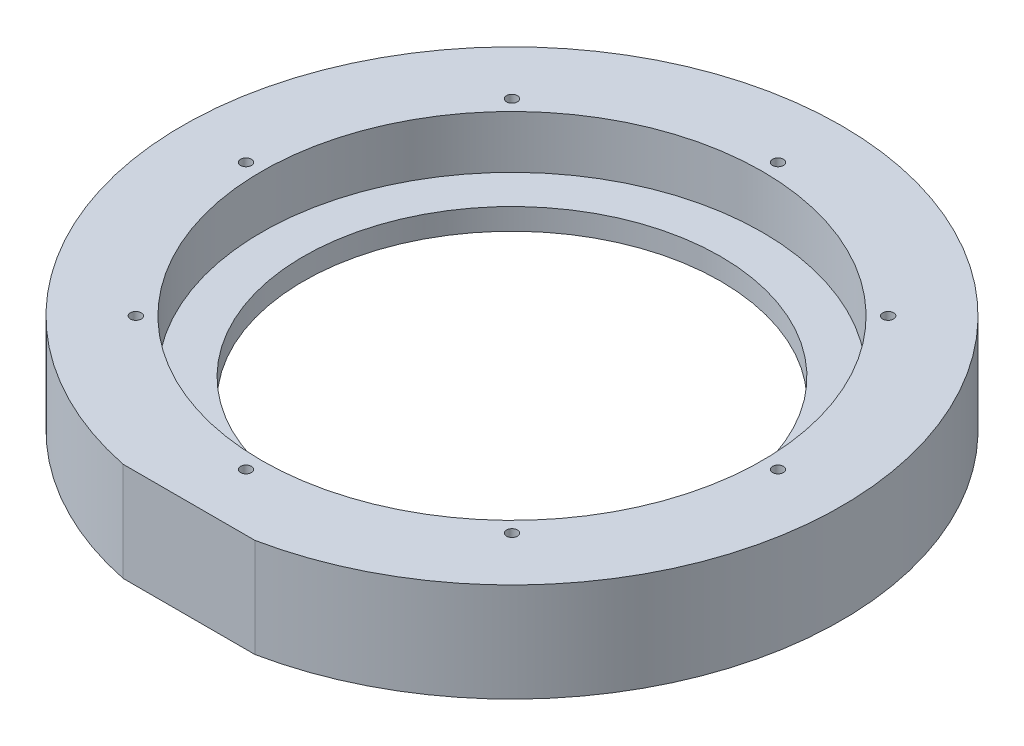
ISO-10303-21;
HEADER;
FILE_DESCRIPTION(('STEP AP214'),'2;1');
FILE_NAME('part.step','',(''),(''),'','','');
FILE_SCHEMA(('AUTOMOTIVE_DESIGN { 1 0 10303 214 1 1 1 1 }'));
ENDSEC;
DATA;
#1=APPLICATION_CONTEXT('core data for automotive mechanical design processes');
#2=APPLICATION_PROTOCOL_DEFINITION('international standard','automotive_design',2000,#1);
#3=PRODUCT_CONTEXT('',#1,'mechanical');
#4=PRODUCT('Part','Part','',(#3));
#5=PRODUCT_RELATED_PRODUCT_CATEGORY('part','',(#4));
#6=PRODUCT_DEFINITION_FORMATION('','',#4);
#7=PRODUCT_DEFINITION_CONTEXT('part definition',#1,'design');
#8=PRODUCT_DEFINITION('design','',#6,#7);
#9=PRODUCT_DEFINITION_SHAPE('','',#8);
#10=(LENGTH_UNIT() NAMED_UNIT(*) SI_UNIT(.MILLI.,.METRE.));
#11=(NAMED_UNIT(*) PLANE_ANGLE_UNIT() SI_UNIT($,.RADIAN.));
#12=(NAMED_UNIT(*) SI_UNIT($,.STERADIAN.) SOLID_ANGLE_UNIT());
#13=UNCERTAINTY_MEASURE_WITH_UNIT(LENGTH_MEASURE(1.E-05),#10,'distance_accuracy_value','');
#14=(GEOMETRIC_REPRESENTATION_CONTEXT(3) GLOBAL_UNCERTAINTY_ASSIGNED_CONTEXT((#13)) GLOBAL_UNIT_ASSIGNED_CONTEXT((#10,
#11,#12)) REPRESENTATION_CONTEXT('',''));
#15=CARTESIAN_POINT('',(0.,0.,0.));
#16=DIRECTION('',(0.,0.,1.));
#17=DIRECTION('',(1.,0.,0.));
#18=AXIS2_PLACEMENT_3D('',#15,#16,#17);
#19=CARTESIAN_POINT('',(0.,0.,0.));
#20=DIRECTION('',(0.,-1.,0.));
#21=DIRECTION('',(0.,0.,-1.));
#22=AXIS2_PLACEMENT_3D('',#19,#20,#21);
#23=CYLINDRICAL_SURFACE('',#22,80.3783);
#24=CARTESIAN_POINT('',(0.,0.,0.));
#25=DIRECTION('',(0.,-1.,0.));
#26=DIRECTION('',(0.,0.,-1.));
#27=AXIS2_PLACEMENT_3D('',#24,#25,#26);
#28=CIRCLE('',#27,80.3783);
#29=CARTESIAN_POINT('',(0.,0.,-80.3783));
#30=VERTEX_POINT('',#29);
#31=EDGE_CURVE('E11',#30,#30,#28,.T.);
#32=ORIENTED_EDGE('',*,*,#31,.T.);
#33=EDGE_LOOP('',(#32));
#34=FACE_BOUND('',#33,.T.);
#35=CARTESIAN_POINT('',(0.,8.255,0.));
#36=DIRECTION('',(0.,-1.,0.));
#37=DIRECTION('',(0.,0.,-1.));
#38=AXIS2_PLACEMENT_3D('',#35,#36,#37);
#39=CIRCLE('',#38,80.3783);
#40=CARTESIAN_POINT('',(0.,8.255,-80.3783));
#41=VERTEX_POINT('',#40);
#42=EDGE_CURVE('E151',#41,#41,#39,.T.);
#43=ORIENTED_EDGE('',*,*,#42,.F.);
#44=EDGE_LOOP('',(#43));
#45=FACE_BOUND('',#44,.T.);
#46=ADVANCED_FACE('F42',(#34,#45),#23,.F.);
#47=CARTESIAN_POINT('',(80.3783,0.,0.));
#48=DIRECTION('',(0.,-1.,0.));
#49=DIRECTION('',(0.,0.,-1.));
#50=AXIS2_PLACEMENT_3D('',#47,#48,#49);
#51=PLANE('',#50);
#52=CARTESIAN_POINT('',(6.35,0.,85.09));
#53=DIRECTION('',(0.,-1.,0.));
#54=DIRECTION('',(0.,0.,-1.));
#55=AXIS2_PLACEMENT_3D('',#52,#53,#54);
#56=CIRCLE('',#55,1.72719999999999);
#57=CARTESIAN_POINT('',(6.35,0.,83.3628));
#58=VERTEX_POINT('',#57);
#59=EDGE_CURVE('E214',#58,#58,#56,.T.);
#60=ORIENTED_EDGE('',*,*,#59,.F.);
#61=EDGE_LOOP('',(#60));
#62=FACE_BOUND('',#61,.T.);
#63=CARTESIAN_POINT('',(-6.35,0.,85.09));
#64=DIRECTION('',(0.,-1.,0.));
#65=DIRECTION('',(0.,0.,-1.));
#66=AXIS2_PLACEMENT_3D('',#63,#64,#65);
#67=CIRCLE('',#66,1.72719999999999);
#68=CARTESIAN_POINT('',(-6.35,0.,83.3628));
#69=VERTEX_POINT('',#68);
#70=EDGE_CURVE('E208',#69,#69,#67,.T.);
#71=ORIENTED_EDGE('',*,*,#70,.F.);
#72=EDGE_LOOP('',(#71));
#73=FACE_BOUND('',#72,.T.);
#74=CARTESIAN_POINT('',(0.,0.,0.));
#75=DIRECTION('',(0.,-1.,0.));
#76=DIRECTION('',(0.,0.,-1.));
#77=AXIS2_PLACEMENT_3D('',#74,#75,#76);
#78=CIRCLE('',#77,99.4283);
#79=CARTESIAN_POINT('',(0.,0.,-99.4283));
#80=VERTEX_POINT('',#79);
#81=EDGE_CURVE('E49',#80,#80,#78,.T.);
#82=ORIENTED_EDGE('',*,*,#81,.T.);
#83=EDGE_LOOP('',(#82));
#84=FACE_BOUND('',#83,.T.);
#85=ORIENTED_EDGE('',*,*,#31,.F.);
#86=EDGE_LOOP('',(#85));
#87=FACE_BOUND('',#86,.T.);
#88=ADVANCED_FACE('F127',(#62,#73,#84,#87),#51,.T.);
#89=CARTESIAN_POINT('',(0.,0.,0.));
#90=DIRECTION('',(0.,-1.,0.));
#91=DIRECTION('',(0.,0.,-1.));
#92=AXIS2_PLACEMENT_3D('',#89,#90,#91);
#93=CYLINDRICAL_SURFACE('',#92,99.4283);
#94=CARTESIAN_POINT('',(0.,-6.985,0.));
#95=DIRECTION('',(0.,-1.,0.));
#96=DIRECTION('',(0.,0.,-1.));
#97=AXIS2_PLACEMENT_3D('',#94,#95,#96);
#98=CIRCLE('',#97,99.4283);
#99=CARTESIAN_POINT('',(0.,-6.985,-99.4283));
#100=VERTEX_POINT('',#99);
#101=EDGE_CURVE('E122',#100,#100,#98,.T.);
#102=ORIENTED_EDGE('',*,*,#101,.T.);
#103=EDGE_LOOP('',(#102));
#104=FACE_BOUND('',#103,.T.);
#105=ORIENTED_EDGE('',*,*,#81,.F.);
#106=EDGE_LOOP('',(#105));
#107=FACE_BOUND('',#106,.T.);
#108=ADVANCED_FACE('F130',(#104,#107),#93,.F.);
#109=CARTESIAN_POINT('',(99.4283,-6.985,0.));
#110=DIRECTION('',(0.,-1.,0.));
#111=DIRECTION('',(0.,0.,-1.));
#112=AXIS2_PLACEMENT_3D('',#109,#110,#111);
#113=PLANE('',#112);
#114=CARTESIAN_POINT('',(0.,-6.985,0.));
#115=DIRECTION('',(0.,-1.,0.));
#116=DIRECTION('',(0.,0.,-1.));
#117=AXIS2_PLACEMENT_3D('',#114,#115,#116);
#118=CIRCLE('',#117,109.7915);
#119=CARTESIAN_POINT('',(0.,-6.985,-109.7915));
#120=VERTEX_POINT('',#119);
#121=EDGE_CURVE('E119',#120,#120,#118,.T.);
#122=ORIENTED_EDGE('',*,*,#121,.T.);
#123=EDGE_LOOP('',(#122));
#124=FACE_BOUND('',#123,.T.);
#125=ORIENTED_EDGE('',*,*,#101,.F.);
#126=EDGE_LOOP('',(#125));
#127=FACE_BOUND('',#126,.T.);
#128=ADVANCED_FACE('F132',(#124,#127),#113,.T.);
#129=CARTESIAN_POINT('',(0.,0.,0.));
#130=DIRECTION('',(0.,-1.,0.));
#131=DIRECTION('',(0.,0.,-1.));
#132=AXIS2_PLACEMENT_3D('',#129,#130,#131);
#133=CYLINDRICAL_SURFACE('',#132,109.7915);
#134=CARTESIAN_POINT('',(0.,-9.525,0.));
#135=DIRECTION('',(0.,-1.,0.));
#136=DIRECTION('',(0.,0.,-1.));
#137=AXIS2_PLACEMENT_3D('',#134,#135,#136);
#138=CIRCLE('',#137,109.7915);
#139=CARTESIAN_POINT('',(0.,-9.525,-109.7915));
#140=VERTEX_POINT('',#139);
#141=EDGE_CURVE('E110',#140,#140,#138,.T.);
#142=ORIENTED_EDGE('',*,*,#141,.T.);
#143=EDGE_LOOP('',(#142));
#144=FACE_BOUND('',#143,.T.);
#145=ORIENTED_EDGE('',*,*,#121,.F.);
#146=EDGE_LOOP('',(#145));
#147=FACE_BOUND('',#146,.T.);
#148=ADVANCED_FACE('F139',(#144,#147),#133,.F.);
#149=CARTESIAN_POINT('',(109.7915,-9.525,0.));
#150=DIRECTION('',(0.,-1.,0.));
#151=DIRECTION('',(0.,0.,-1.));
#152=AXIS2_PLACEMENT_3D('',#149,#150,#151);
#153=PLANE('',#152);
#154=DIRECTION('',(-1.,0.,0.));
#155=VECTOR('',#154,1.);
#156=CARTESIAN_POINT('',(-25.4,-9.525,124.434078933385));
#157=LINE('',#156,#155);
#158=CARTESIAN_POINT('',(25.4,-9.525,124.434078933385));
#159=VERTEX_POINT('',#158);
#160=CARTESIAN_POINT('',(-25.4,-9.525,124.434078933385));
#161=VERTEX_POINT('',#160);
#162=EDGE_CURVE('E97',#159,#161,#157,.T.);
#163=ORIENTED_EDGE('',*,*,#162,.T.);
#164=CARTESIAN_POINT('',(0.,-9.525,0.));
#165=DIRECTION('',(0.,-1.,0.));
#166=DIRECTION('',(0.,0.,-1.));
#167=AXIS2_PLACEMENT_3D('',#164,#165,#166);
#168=CIRCLE('',#167,127.);
#169=EDGE_CURVE('E104',#161,#159,#168,.T.);
#170=ORIENTED_EDGE('',*,*,#169,.T.);
#171=EDGE_LOOP('',(#163,#170));
#172=FACE_BOUND('',#171,.T.);
#173=ORIENTED_EDGE('',*,*,#141,.F.);
#174=EDGE_LOOP('',(#173));
#175=FACE_BOUND('',#174,.T.);
#176=ADVANCED_FACE('F248',(#172,#175),#153,.T.);
#177=CARTESIAN_POINT('',(0.,0.,0.));
#178=DIRECTION('',(0.,-1.,0.));
#179=DIRECTION('',(0.,0.,-1.));
#180=AXIS2_PLACEMENT_3D('',#177,#178,#179);
#181=CYLINDRICAL_SURFACE('',#180,127.);
#182=DIRECTION('',(0.,-1.,0.));
#183=VECTOR('',#182,1.);
#184=CARTESIAN_POINT('',(25.4,0.,124.434078933385));
#185=LINE('',#184,#183);
#186=CARTESIAN_POINT('',(25.4,28.575,124.434078933385));
#187=VERTEX_POINT('',#186);
#188=EDGE_CURVE('E56',#187,#159,#185,.T.);
#189=ORIENTED_EDGE('',*,*,#188,.T.);
#190=ORIENTED_EDGE('',*,*,#169,.F.);
#191=DIRECTION('',(0.,-1.,0.));
#192=VECTOR('',#191,1.);
#193=CARTESIAN_POINT('',(-25.4,0.,124.434078933385));
#194=LINE('',#193,#192);
#195=CARTESIAN_POINT('',(-25.4,28.575,124.434078933385));
#196=VERTEX_POINT('',#195);
#197=EDGE_CURVE('E91',#161,#196,#194,.F.);
#198=ORIENTED_EDGE('',*,*,#197,.T.);
#199=CARTESIAN_POINT('',(0.,28.575,0.));
#200=DIRECTION('',(0.,-1.,0.));
#201=DIRECTION('',(0.,0.,-1.));
#202=AXIS2_PLACEMENT_3D('',#199,#200,#201);
#203=CIRCLE('',#202,127.);
#204=EDGE_CURVE('E102',#196,#187,#203,.T.);
#205=ORIENTED_EDGE('',*,*,#204,.T.);
#206=EDGE_LOOP('',(#189,#190,#198,#205));
#207=FACE_BOUND('',#206,.T.);
#208=ADVANCED_FACE('F101',(#207),#181,.T.);
#209=CARTESIAN_POINT('',(127.,28.575,0.));
#210=DIRECTION('',(0.,1.,0.));
#211=DIRECTION('',(0.,0.,1.));
#212=AXIS2_PLACEMENT_3D('',#209,#210,#211);
#213=PLANE('',#212);
#214=DIRECTION('',(-1.,0.,0.));
#215=VECTOR('',#214,1.);
#216=CARTESIAN_POINT('',(-25.4,28.575,124.434078933385));
#217=LINE('',#216,#215);
#218=EDGE_CURVE('E88',#187,#196,#217,.T.);
#219=ORIENTED_EDGE('',*,*,#218,.F.);
#220=ORIENTED_EDGE('',*,*,#204,.F.);
#221=EDGE_LOOP('',(#219,#220));
#222=FACE_BOUND('',#221,.T.);
#223=CARTESIAN_POINT('',(0.,28.575,-102.5));
#224=DIRECTION('',(0.,1.,0.));
#225=DIRECTION('',(0.,0.,1.));
#226=AXIS2_PLACEMENT_3D('',#223,#224,#225);
#227=CIRCLE('',#226,2.09999999999999);
#228=CARTESIAN_POINT('',(0.,28.575,-100.4));
#229=VERTEX_POINT('',#228);
#230=EDGE_CURVE('E96',#229,#229,#227,.T.);
#231=ORIENTED_EDGE('',*,*,#230,.F.);
#232=EDGE_LOOP('',(#231));
#233=FACE_BOUND('',#232,.T.);
#234=CARTESIAN_POINT('',(72.4784450716223,28.575,-72.47844507162));
#235=DIRECTION('',(0.,1.,0.));
#236=DIRECTION('',(0.,0.,1.));
#237=AXIS2_PLACEMENT_3D('',#234,#235,#236);
#238=CIRCLE('',#237,2.09999999999999);
#239=CARTESIAN_POINT('',(72.4784450716223,28.575,-70.37844507162));
#240=VERTEX_POINT('',#239);
#241=EDGE_CURVE('E195',#240,#240,#238,.T.);
#242=ORIENTED_EDGE('',*,*,#241,.F.);
#243=EDGE_LOOP('',(#242));
#244=FACE_BOUND('',#243,.T.);
#245=CARTESIAN_POINT('',(102.5,28.575,1.75900960464048E-12));
#246=DIRECTION('',(0.,1.,0.));
#247=DIRECTION('',(0.,0.,1.));
#248=AXIS2_PLACEMENT_3D('',#245,#246,#247);
#249=CIRCLE('',#248,2.09999999999999);
#250=CARTESIAN_POINT('',(102.5,28.575,2.10000000000175));
#251=VERTEX_POINT('',#250);
#252=EDGE_CURVE('E189',#251,#251,#249,.T.);
#253=ORIENTED_EDGE('',*,*,#252,.F.);
#254=EDGE_LOOP('',(#253));
#255=FACE_BOUND('',#254,.T.);
#256=CARTESIAN_POINT('',(72.4784450716197,28.575,72.4784450716225));
#257=DIRECTION('',(0.,1.,0.));
#258=DIRECTION('',(0.,0.,1.));
#259=AXIS2_PLACEMENT_3D('',#256,#257,#258);
#260=CIRCLE('',#259,2.09999999999999);
#261=CARTESIAN_POINT('',(72.4784450716197,28.575,74.5784450716225));
#262=VERTEX_POINT('',#261);
#263=EDGE_CURVE('E183',#262,#262,#260,.T.);
#264=ORIENTED_EDGE('',*,*,#263,.F.);
#265=EDGE_LOOP('',(#264));
#266=FACE_BOUND('',#265,.T.);
#267=CARTESIAN_POINT('',(-2.13717932240343E-12,28.575,102.5));
#268=DIRECTION('',(0.,1.,0.));
#269=DIRECTION('',(0.,0.,1.));
#270=AXIS2_PLACEMENT_3D('',#267,#268,#269);
#271=CIRCLE('',#270,2.09999999999999);
#272=CARTESIAN_POINT('',(-2.13717932240343E-12,28.575,104.6));
#273=VERTEX_POINT('',#272);
#274=EDGE_CURVE('E177',#273,#273,#271,.T.);
#275=ORIENTED_EDGE('',*,*,#274,.F.);
#276=EDGE_LOOP('',(#275));
#277=FACE_BOUND('',#276,.T.);
#278=CARTESIAN_POINT('',(-72.4784450716218,28.575,72.4784450716205));
#279=DIRECTION('',(0.,1.,0.));
#280=DIRECTION('',(0.,0.,1.));
#281=AXIS2_PLACEMENT_3D('',#278,#279,#280);
#282=CIRCLE('',#281,2.09999999999999);
#283=CARTESIAN_POINT('',(-72.4784450716218,28.575,74.5784450716205));
#284=VERTEX_POINT('',#283);
#285=EDGE_CURVE('E171',#284,#284,#282,.T.);
#286=ORIENTED_EDGE('',*,*,#285,.F.);
#287=EDGE_LOOP('',(#286));
#288=FACE_BOUND('',#287,.T.);
#289=CARTESIAN_POINT('',(-102.5,28.575,-1.07552855510562E-12));
#290=DIRECTION('',(0.,1.,0.));
#291=DIRECTION('',(0.,0.,1.));
#292=AXIS2_PLACEMENT_3D('',#289,#290,#291);
#293=CIRCLE('',#292,2.09999999999999);
#294=CARTESIAN_POINT('',(-102.5,28.575,2.09999999999892));
#295=VERTEX_POINT('',#294);
#296=EDGE_CURVE('E165',#295,#295,#293,.T.);
#297=ORIENTED_EDGE('',*,*,#296,.F.);
#298=EDGE_LOOP('',(#297));
#299=FACE_BOUND('',#298,.T.);
#300=CARTESIAN_POINT('',(-72.4784450716203,28.575,-72.478445071622));
#301=DIRECTION('',(0.,1.,0.));
#302=DIRECTION('',(0.,0.,1.));
#303=AXIS2_PLACEMENT_3D('',#300,#301,#302);
#304=CIRCLE('',#303,2.09999999999999);
#305=CARTESIAN_POINT('',(-72.4784450716203,28.575,-70.378445071622));
#306=VERTEX_POINT('',#305);
#307=EDGE_CURVE('E157',#306,#306,#304,.T.);
#308=ORIENTED_EDGE('',*,*,#307,.F.);
#309=EDGE_LOOP('',(#308));
#310=FACE_BOUND('',#309,.T.);
#311=CARTESIAN_POINT('',(0.,28.575,0.));
#312=DIRECTION('',(0.,-1.,0.));
#313=DIRECTION('',(0.,0.,-1.));
#314=AXIS2_PLACEMENT_3D('',#311,#312,#313);
#315=CIRCLE('',#314,96.5);
#316=CARTESIAN_POINT('',(0.,28.575,-96.5));
#317=VERTEX_POINT('',#316);
#318=EDGE_CURVE('E108',#317,#317,#315,.T.);
#319=ORIENTED_EDGE('',*,*,#318,.T.);
#320=EDGE_LOOP('',(#319));
#321=FACE_BOUND('',#320,.T.);
#322=ADVANCED_FACE('F106',(#222,#233,#244,#255,#266,#277,#288,#299,#310,#321),#213,.T.);
#323=CARTESIAN_POINT('',(0.,0.,0.));
#324=DIRECTION('',(0.,-1.,0.));
#325=DIRECTION('',(0.,0.,-1.));
#326=AXIS2_PLACEMENT_3D('',#323,#324,#325);
#327=CYLINDRICAL_SURFACE('',#326,96.5);
#328=CARTESIAN_POINT('',(0.,8.255,0.));
#329=DIRECTION('',(0.,-1.,0.));
#330=DIRECTION('',(0.,0.,-1.));
#331=AXIS2_PLACEMENT_3D('',#328,#329,#330);
#332=CIRCLE('',#331,96.5);
#333=CARTESIAN_POINT('',(0.,8.255,-96.5));
#334=VERTEX_POINT('',#333);
#335=EDGE_CURVE('E113',#334,#334,#332,.T.);
#336=ORIENTED_EDGE('',*,*,#335,.T.);
#337=EDGE_LOOP('',(#336));
#338=FACE_BOUND('',#337,.T.);
#339=ORIENTED_EDGE('',*,*,#318,.F.);
#340=EDGE_LOOP('',(#339));
#341=FACE_BOUND('',#340,.T.);
#342=ADVANCED_FACE('F232',(#338,#341),#327,.F.);
#343=CARTESIAN_POINT('',(80.3783,8.255,0.));
#344=DIRECTION('',(0.,1.,0.));
#345=DIRECTION('',(0.,0.,1.));
#346=AXIS2_PLACEMENT_3D('',#343,#344,#345);
#347=PLANE('',#346);
#348=CARTESIAN_POINT('',(6.35,8.255,85.09));
#349=DIRECTION('',(0.,1.,0.));
#350=DIRECTION('',(0.,0.,1.));
#351=AXIS2_PLACEMENT_3D('',#348,#349,#350);
#352=CIRCLE('',#351,1.72719999999999);
#353=CARTESIAN_POINT('',(6.35,8.255,86.8172));
#354=VERTEX_POINT('',#353);
#355=EDGE_CURVE('E211',#354,#354,#352,.T.);
#356=ORIENTED_EDGE('',*,*,#355,.F.);
#357=EDGE_LOOP('',(#356));
#358=FACE_BOUND('',#357,.T.);
#359=CARTESIAN_POINT('',(-6.35,8.255,85.09));
#360=DIRECTION('',(0.,1.,0.));
#361=DIRECTION('',(0.,0.,1.));
#362=AXIS2_PLACEMENT_3D('',#359,#360,#361);
#363=CIRCLE('',#362,1.72719999999999);
#364=CARTESIAN_POINT('',(-6.35,8.255,86.8172));
#365=VERTEX_POINT('',#364);
#366=EDGE_CURVE('E205',#365,#365,#363,.T.);
#367=ORIENTED_EDGE('',*,*,#366,.F.);
#368=EDGE_LOOP('',(#367));
#369=FACE_BOUND('',#368,.T.);
#370=ORIENTED_EDGE('',*,*,#42,.T.);
#371=EDGE_LOOP('',(#370));
#372=FACE_BOUND('',#371,.T.);
#373=ORIENTED_EDGE('',*,*,#335,.F.);
#374=EDGE_LOOP('',(#373));
#375=FACE_BOUND('',#374,.T.);
#376=ADVANCED_FACE('F229',(#358,#369,#372,#375),#347,.T.);
#377=CARTESIAN_POINT('',(-72.4784450716203,11.176,-72.478445071622));
#378=DIRECTION('',(0.,1.,0.));
#379=DIRECTION('',(0.,0.,1.));
#380=AXIS2_PLACEMENT_3D('',#377,#378,#379);
#381=CONICAL_SURFACE('',#380,2.09999999999999,1.02974425867665);
#382=CARTESIAN_POINT('',(-72.4784450716203,9.91419270004212,-72.478445071622));
#383=VERTEX_POINT('',#382);
#384=VERTEX_LOOP('',#383);
#385=FACE_BOUND('',#384,.T.);
#386=CARTESIAN_POINT('',(-72.4784450716203,11.176,-72.478445071622));
#387=DIRECTION('',(0.,1.,0.));
#388=DIRECTION('',(0.,0.,1.));
#389=AXIS2_PLACEMENT_3D('',#386,#387,#388);
#390=CIRCLE('',#389,2.09999999999999);
#391=CARTESIAN_POINT('',(-72.4784450716203,11.176,-70.378445071622));
#392=VERTEX_POINT('',#391);
#393=EDGE_CURVE('E153',#392,#392,#390,.T.);
#394=ORIENTED_EDGE('',*,*,#393,.T.);
#395=EDGE_LOOP('',(#394));
#396=FACE_BOUND('',#395,.T.);
#397=ADVANCED_FACE('F231',(#385,#396),#381,.F.);
#398=CARTESIAN_POINT('',(-72.4784450716203,28.575,-72.478445071622));
#399=DIRECTION('',(0.,1.,0.));
#400=DIRECTION('',(0.,0.,1.));
#401=AXIS2_PLACEMENT_3D('',#398,#399,#400);
#402=CYLINDRICAL_SURFACE('',#401,2.09999999999999);
#403=ORIENTED_EDGE('',*,*,#393,.F.);
#404=EDGE_LOOP('',(#403));
#405=FACE_BOUND('',#404,.T.);
#406=ORIENTED_EDGE('',*,*,#307,.T.);
#407=EDGE_LOOP('',(#406));
#408=FACE_BOUND('',#407,.T.);
#409=ADVANCED_FACE('F330',(#405,#408),#402,.F.);
#410=CARTESIAN_POINT('',(-102.5,11.176,-1.07552855510562E-12));
#411=DIRECTION('',(0.,1.,0.));
#412=DIRECTION('',(0.,0.,1.));
#413=AXIS2_PLACEMENT_3D('',#410,#411,#412);
#414=CONICAL_SURFACE('',#413,2.09999999999999,1.02974425867665);
#415=CARTESIAN_POINT('',(-102.5,9.91419270004212,-1.07552855510562E-12));
#416=VERTEX_POINT('',#415);
#417=VERTEX_LOOP('',#416);
#418=FACE_BOUND('',#417,.T.);
#419=CARTESIAN_POINT('',(-102.5,11.176,-1.07552855510562E-12));
#420=DIRECTION('',(0.,1.,0.));
#421=DIRECTION('',(0.,0.,1.));
#422=AXIS2_PLACEMENT_3D('',#419,#420,#421);
#423=CIRCLE('',#422,2.09999999999999);
#424=CARTESIAN_POINT('',(-102.5,11.176,2.09999999999892));
#425=VERTEX_POINT('',#424);
#426=EDGE_CURVE('E162',#425,#425,#423,.T.);
#427=ORIENTED_EDGE('',*,*,#426,.T.);
#428=EDGE_LOOP('',(#427));
#429=FACE_BOUND('',#428,.T.);
#430=ADVANCED_FACE('F336',(#418,#429),#414,.F.);
#431=CARTESIAN_POINT('',(-102.5,28.575,-1.07552855510562E-12));
#432=DIRECTION('',(0.,1.,0.));
#433=DIRECTION('',(0.,0.,1.));
#434=AXIS2_PLACEMENT_3D('',#431,#432,#433);
#435=CYLINDRICAL_SURFACE('',#434,2.09999999999999);
#436=ORIENTED_EDGE('',*,*,#426,.F.);
#437=EDGE_LOOP('',(#436));
#438=FACE_BOUND('',#437,.T.);
#439=ORIENTED_EDGE('',*,*,#296,.T.);
#440=EDGE_LOOP('',(#439));
#441=FACE_BOUND('',#440,.T.);
#442=ADVANCED_FACE('F345',(#438,#441),#435,.F.);
#443=CARTESIAN_POINT('',(-72.4784450716218,11.176,72.4784450716205));
#444=DIRECTION('',(0.,1.,0.));
#445=DIRECTION('',(0.,0.,1.));
#446=AXIS2_PLACEMENT_3D('',#443,#444,#445);
#447=CONICAL_SURFACE('',#446,2.09999999999999,1.02974425867665);
#448=CARTESIAN_POINT('',(-72.4784450716218,9.91419270004212,72.4784450716205));
#449=VERTEX_POINT('',#448);
#450=VERTEX_LOOP('',#449);
#451=FACE_BOUND('',#450,.T.);
#452=CARTESIAN_POINT('',(-72.4784450716218,11.176,72.4784450716205));
#453=DIRECTION('',(0.,1.,0.));
#454=DIRECTION('',(0.,0.,1.));
#455=AXIS2_PLACEMENT_3D('',#452,#453,#454);
#456=CIRCLE('',#455,2.09999999999999);
#457=CARTESIAN_POINT('',(-72.4784450716218,11.176,74.5784450716205));
#458=VERTEX_POINT('',#457);
#459=EDGE_CURVE('E168',#458,#458,#456,.T.);
#460=ORIENTED_EDGE('',*,*,#459,.T.);
#461=EDGE_LOOP('',(#460));
#462=FACE_BOUND('',#461,.T.);
#463=ADVANCED_FACE('F350',(#451,#462),#447,.F.);
#464=CARTESIAN_POINT('',(-72.4784450716218,28.575,72.4784450716205));
#465=DIRECTION('',(0.,1.,0.));
#466=DIRECTION('',(0.,0.,1.));
#467=AXIS2_PLACEMENT_3D('',#464,#465,#466);
#468=CYLINDRICAL_SURFACE('',#467,2.09999999999999);
#469=ORIENTED_EDGE('',*,*,#459,.F.);
#470=EDGE_LOOP('',(#469));
#471=FACE_BOUND('',#470,.T.);
#472=ORIENTED_EDGE('',*,*,#285,.T.);
#473=EDGE_LOOP('',(#472));
#474=FACE_BOUND('',#473,.T.);
#475=ADVANCED_FACE('F358',(#471,#474),#468,.F.);
#476=CARTESIAN_POINT('',(-2.13717932240343E-12,11.176,102.5));
#477=DIRECTION('',(0.,1.,0.));
#478=DIRECTION('',(0.,0.,1.));
#479=AXIS2_PLACEMENT_3D('',#476,#477,#478);
#480=CONICAL_SURFACE('',#479,2.1,1.02974425867665);
#481=CARTESIAN_POINT('',(-2.14174990198931E-12,9.91419270004212,102.5));
#482=VERTEX_POINT('',#481);
#483=VERTEX_LOOP('',#482);
#484=FACE_BOUND('',#483,.T.);
#485=CARTESIAN_POINT('',(-2.13717932240343E-12,11.176,102.5));
#486=DIRECTION('',(0.,1.,0.));
#487=DIRECTION('',(0.,0.,1.));
#488=AXIS2_PLACEMENT_3D('',#485,#486,#487);
#489=CIRCLE('',#488,2.1);
#490=CARTESIAN_POINT('',(-2.13717932240343E-12,11.176,104.6));
#491=VERTEX_POINT('',#490);
#492=EDGE_CURVE('E174',#491,#491,#489,.T.);
#493=ORIENTED_EDGE('',*,*,#492,.T.);
#494=EDGE_LOOP('',(#493));
#495=FACE_BOUND('',#494,.T.);
#496=ADVANCED_FACE('F363',(#484,#495),#480,.F.);
#497=CARTESIAN_POINT('',(-2.13717932240343E-12,28.575,102.5));
#498=DIRECTION('',(0.,1.,0.));
#499=DIRECTION('',(0.,0.,1.));
#500=AXIS2_PLACEMENT_3D('',#497,#498,#499);
#501=CYLINDRICAL_SURFACE('',#500,2.09999999999999);
#502=ORIENTED_EDGE('',*,*,#492,.F.);
#503=EDGE_LOOP('',(#502));
#504=FACE_BOUND('',#503,.T.);
#505=ORIENTED_EDGE('',*,*,#274,.T.);
#506=EDGE_LOOP('',(#505));
#507=FACE_BOUND('',#506,.T.);
#508=ADVANCED_FACE('F371',(#504,#507),#501,.F.);
#509=CARTESIAN_POINT('',(72.4784450716197,11.176,72.4784450716225));
#510=DIRECTION('',(0.,1.,0.));
#511=DIRECTION('',(0.,0.,1.));
#512=AXIS2_PLACEMENT_3D('',#509,#510,#511);
#513=CONICAL_SURFACE('',#512,2.09999999999999,1.02974425867665);
#514=CARTESIAN_POINT('',(72.4784450716197,9.91419270004212,72.4784450716225));
#515=VERTEX_POINT('',#514);
#516=VERTEX_LOOP('',#515);
#517=FACE_BOUND('',#516,.T.);
#518=CARTESIAN_POINT('',(72.4784450716197,11.176,72.4784450716225));
#519=DIRECTION('',(0.,1.,0.));
#520=DIRECTION('',(0.,0.,1.));
#521=AXIS2_PLACEMENT_3D('',#518,#519,#520);
#522=CIRCLE('',#521,2.09999999999999);
#523=CARTESIAN_POINT('',(72.4784450716197,11.176,74.5784450716225));
#524=VERTEX_POINT('',#523);
#525=EDGE_CURVE('E180',#524,#524,#522,.T.);
#526=ORIENTED_EDGE('',*,*,#525,.T.);
#527=EDGE_LOOP('',(#526));
#528=FACE_BOUND('',#527,.T.);
#529=ADVANCED_FACE('F376',(#517,#528),#513,.F.);
#530=CARTESIAN_POINT('',(72.4784450716197,28.575,72.4784450716225));
#531=DIRECTION('',(0.,1.,0.));
#532=DIRECTION('',(0.,0.,1.));
#533=AXIS2_PLACEMENT_3D('',#530,#531,#532);
#534=CYLINDRICAL_SURFACE('',#533,2.09999999999999);
#535=ORIENTED_EDGE('',*,*,#525,.F.);
#536=EDGE_LOOP('',(#535));
#537=FACE_BOUND('',#536,.T.);
#538=ORIENTED_EDGE('',*,*,#263,.T.);
#539=EDGE_LOOP('',(#538));
#540=FACE_BOUND('',#539,.T.);
#541=ADVANCED_FACE('F384',(#537,#540),#534,.F.);
#542=CARTESIAN_POINT('',(102.5,11.176,1.75900960464048E-12));
#543=DIRECTION('',(0.,1.,0.));
#544=DIRECTION('',(0.,0.,1.));
#545=AXIS2_PLACEMENT_3D('',#542,#543,#544);
#546=CONICAL_SURFACE('',#545,2.09999999999999,1.02974425867665);
#547=CARTESIAN_POINT('',(102.5,9.91419270004212,1.75900960464048E-12));
#548=VERTEX_POINT('',#547);
#549=VERTEX_LOOP('',#548);
#550=FACE_BOUND('',#549,.T.);
#551=CARTESIAN_POINT('',(102.5,11.176,1.75900960464048E-12));
#552=DIRECTION('',(0.,1.,0.));
#553=DIRECTION('',(0.,0.,1.));
#554=AXIS2_PLACEMENT_3D('',#551,#552,#553);
#555=CIRCLE('',#554,2.09999999999999);
#556=CARTESIAN_POINT('',(102.5,11.176,2.10000000000175));
#557=VERTEX_POINT('',#556);
#558=EDGE_CURVE('E186',#557,#557,#555,.T.);
#559=ORIENTED_EDGE('',*,*,#558,.T.);
#560=EDGE_LOOP('',(#559));
#561=FACE_BOUND('',#560,.T.);
#562=ADVANCED_FACE('F389',(#550,#561),#546,.F.);
#563=CARTESIAN_POINT('',(102.5,28.575,1.75900960464048E-12));
#564=DIRECTION('',(0.,1.,0.));
#565=DIRECTION('',(0.,0.,1.));
#566=AXIS2_PLACEMENT_3D('',#563,#564,#565);
#567=CYLINDRICAL_SURFACE('',#566,2.09999999999999);
#568=ORIENTED_EDGE('',*,*,#558,.F.);
#569=EDGE_LOOP('',(#568));
#570=FACE_BOUND('',#569,.T.);
#571=ORIENTED_EDGE('',*,*,#252,.T.);
#572=EDGE_LOOP('',(#571));
#573=FACE_BOUND('',#572,.T.);
#574=ADVANCED_FACE('F397',(#570,#573),#567,.F.);
#575=CARTESIAN_POINT('',(72.4784450716223,11.176,-72.47844507162));
#576=DIRECTION('',(0.,1.,0.));
#577=DIRECTION('',(0.,0.,1.));
#578=AXIS2_PLACEMENT_3D('',#575,#576,#577);
#579=CONICAL_SURFACE('',#578,2.09999999999999,1.02974425867665);
#580=CARTESIAN_POINT('',(72.4784450716223,9.91419270004212,-72.47844507162));
#581=VERTEX_POINT('',#580);
#582=VERTEX_LOOP('',#581);
#583=FACE_BOUND('',#582,.T.);
#584=CARTESIAN_POINT('',(72.4784450716223,11.176,-72.47844507162));
#585=DIRECTION('',(0.,1.,0.));
#586=DIRECTION('',(0.,0.,1.));
#587=AXIS2_PLACEMENT_3D('',#584,#585,#586);
#588=CIRCLE('',#587,2.09999999999999);
#589=CARTESIAN_POINT('',(72.4784450716223,11.176,-70.37844507162));
#590=VERTEX_POINT('',#589);
#591=EDGE_CURVE('E192',#590,#590,#588,.T.);
#592=ORIENTED_EDGE('',*,*,#591,.T.);
#593=EDGE_LOOP('',(#592));
#594=FACE_BOUND('',#593,.T.);
#595=ADVANCED_FACE('F402',(#583,#594),#579,.F.);
#596=CARTESIAN_POINT('',(72.4784450716223,28.575,-72.47844507162));
#597=DIRECTION('',(0.,1.,0.));
#598=DIRECTION('',(0.,0.,1.));
#599=AXIS2_PLACEMENT_3D('',#596,#597,#598);
#600=CYLINDRICAL_SURFACE('',#599,2.09999999999999);
#601=ORIENTED_EDGE('',*,*,#591,.F.);
#602=EDGE_LOOP('',(#601));
#603=FACE_BOUND('',#602,.T.);
#604=ORIENTED_EDGE('',*,*,#241,.T.);
#605=EDGE_LOOP('',(#604));
#606=FACE_BOUND('',#605,.T.);
#607=ADVANCED_FACE('F410',(#603,#606),#600,.F.);
#608=CARTESIAN_POINT('',(0.,11.176,-102.5));
#609=DIRECTION('',(0.,1.,0.));
#610=DIRECTION('',(0.,0.,1.));
#611=AXIS2_PLACEMENT_3D('',#608,#609,#610);
#612=CONICAL_SURFACE('',#611,2.1,1.02974425867665);
#613=CARTESIAN_POINT('',(0.,9.91419270004212,-102.5));
#614=VERTEX_POINT('',#613);
#615=VERTEX_LOOP('',#614);
#616=FACE_BOUND('',#615,.T.);
#617=CARTESIAN_POINT('',(0.,11.176,-102.5));
#618=DIRECTION('',(0.,1.,0.));
#619=DIRECTION('',(0.,0.,1.));
#620=AXIS2_PLACEMENT_3D('',#617,#618,#619);
#621=CIRCLE('',#620,2.1);
#622=CARTESIAN_POINT('',(0.,11.176,-100.4));
#623=VERTEX_POINT('',#622);
#624=EDGE_CURVE('E198',#623,#623,#621,.T.);
#625=ORIENTED_EDGE('',*,*,#624,.T.);
#626=EDGE_LOOP('',(#625));
#627=FACE_BOUND('',#626,.T.);
#628=ADVANCED_FACE('F415',(#616,#627),#612,.F.);
#629=CARTESIAN_POINT('',(0.,28.575,-102.5));
#630=DIRECTION('',(0.,1.,0.));
#631=DIRECTION('',(0.,0.,1.));
#632=AXIS2_PLACEMENT_3D('',#629,#630,#631);
#633=CYLINDRICAL_SURFACE('',#632,2.09999999999999);
#634=ORIENTED_EDGE('',*,*,#624,.F.);
#635=EDGE_LOOP('',(#634));
#636=FACE_BOUND('',#635,.T.);
#637=ORIENTED_EDGE('',*,*,#230,.T.);
#638=EDGE_LOOP('',(#637));
#639=FACE_BOUND('',#638,.T.);
#640=ADVANCED_FACE('F290',(#636,#639),#633,.F.);
#641=CARTESIAN_POINT('',(-25.4,-9.526,124.434078933385));
#642=DIRECTION('',(0.,0.,-1.));
#643=DIRECTION('',(-1.,0.,0.));
#644=AXIS2_PLACEMENT_3D('',#641,#642,#643);
#645=PLANE('',#644);
#646=ORIENTED_EDGE('',*,*,#188,.F.);
#647=ORIENTED_EDGE('',*,*,#218,.T.);
#648=ORIENTED_EDGE('',*,*,#197,.F.);
#649=ORIENTED_EDGE('',*,*,#162,.F.);
#650=EDGE_LOOP('',(#646,#647,#648,#649));
#651=FACE_BOUND('',#650,.T.);
#652=ADVANCED_FACE('F90',(#651),#645,.F.);
#653=CARTESIAN_POINT('',(-6.35,0.,85.09));
#654=DIRECTION('',(0.,-1.,0.));
#655=DIRECTION('',(0.,0.,-1.));
#656=AXIS2_PLACEMENT_3D('',#653,#654,#655);
#657=CYLINDRICAL_SURFACE('',#656,1.72719999999999);
#658=ORIENTED_EDGE('',*,*,#70,.T.);
#659=EDGE_LOOP('',(#658));
#660=FACE_BOUND('',#659,.T.);
#661=ORIENTED_EDGE('',*,*,#366,.T.);
#662=EDGE_LOOP('',(#661));
#663=FACE_BOUND('',#662,.T.);
#664=ADVANCED_FACE('F223',(#660,#663),#657,.F.);
#665=CARTESIAN_POINT('',(6.35,0.,85.09));
#666=DIRECTION('',(0.,-1.,0.));
#667=DIRECTION('',(0.,0.,-1.));
#668=AXIS2_PLACEMENT_3D('',#665,#666,#667);
#669=CYLINDRICAL_SURFACE('',#668,1.72719999999999);
#670=ORIENTED_EDGE('',*,*,#59,.T.);
#671=EDGE_LOOP('',(#670));
#672=FACE_BOUND('',#671,.T.);
#673=ORIENTED_EDGE('',*,*,#355,.T.);
#674=EDGE_LOOP('',(#673));
#675=FACE_BOUND('',#674,.T.);
#676=ADVANCED_FACE('F218',(#672,#675),#669,.F.);
#677=CLOSED_SHELL('',(#46,#88,#108,#128,#148,#176,#208,#322,#342,#376,#397,#409,#430,#442,#463,
#475,#496,#508,#529,#541,#562,#574,#595,#607,#628,#640,#652,#664,#676));
#678=MANIFOLD_SOLID_BREP('B2',#677);
#679=ADVANCED_BREP_SHAPE_REPRESENTATION('',(#18,#678),#14);
#680=SHAPE_DEFINITION_REPRESENTATION(#9,#679);
ENDSEC;
END-ISO-10303-21;
